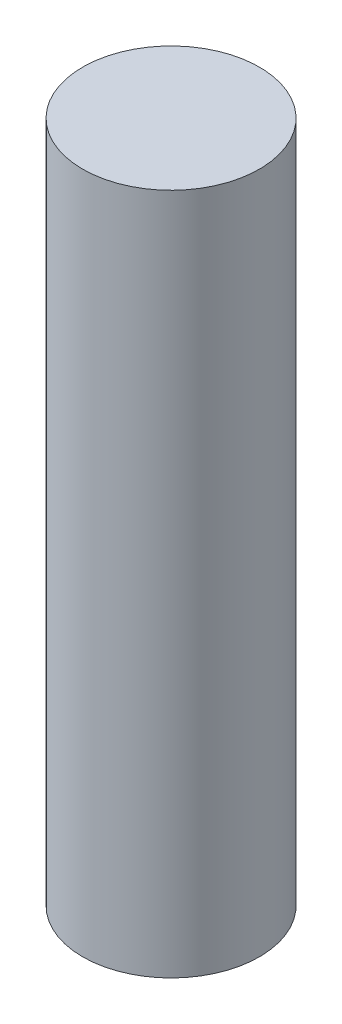
ISO-10303-21;
HEADER;
FILE_DESCRIPTION(('STEP AP214'),'2;1');
FILE_NAME('part.step','',(''),(''),'','','');
FILE_SCHEMA(('AUTOMOTIVE_DESIGN { 1 0 10303 214 1 1 1 1 }'));
ENDSEC;
DATA;
#1=APPLICATION_CONTEXT('core data for automotive mechanical design processes');
#2=APPLICATION_PROTOCOL_DEFINITION('international standard','automotive_design',2000,#1);
#3=PRODUCT_CONTEXT('',#1,'mechanical');
#4=PRODUCT('Part','Part','',(#3));
#5=PRODUCT_RELATED_PRODUCT_CATEGORY('part','',(#4));
#6=PRODUCT_DEFINITION_FORMATION('','',#4);
#7=PRODUCT_DEFINITION_CONTEXT('part definition',#1,'design');
#8=PRODUCT_DEFINITION('design','',#6,#7);
#9=PRODUCT_DEFINITION_SHAPE('','',#8);
#10=(LENGTH_UNIT() NAMED_UNIT(*) SI_UNIT(.MILLI.,.METRE.));
#11=(NAMED_UNIT(*) PLANE_ANGLE_UNIT() SI_UNIT($,.RADIAN.));
#12=(NAMED_UNIT(*) SI_UNIT($,.STERADIAN.) SOLID_ANGLE_UNIT());
#13=UNCERTAINTY_MEASURE_WITH_UNIT(LENGTH_MEASURE(1.E-05),#10,'distance_accuracy_value','');
#14=(GEOMETRIC_REPRESENTATION_CONTEXT(3) GLOBAL_UNCERTAINTY_ASSIGNED_CONTEXT((#13)) GLOBAL_UNIT_ASSIGNED_CONTEXT((#10,
#11,#12)) REPRESENTATION_CONTEXT('',''));
#15=CARTESIAN_POINT('',(0.,0.,0.));
#16=DIRECTION('',(0.,0.,1.));
#17=DIRECTION('',(1.,0.,0.));
#18=AXIS2_PLACEMENT_3D('',#15,#16,#17);
#19=CARTESIAN_POINT('',(0.,24.5,0.));
#20=DIRECTION('',(0.,-1.,0.));
#21=DIRECTION('',(0.,0.,-1.));
#22=AXIS2_PLACEMENT_3D('',#19,#20,#21);
#23=CYLINDRICAL_SURFACE('',#22,3.175);
#24=CARTESIAN_POINT('',(0.,24.5,0.));
#25=DIRECTION('',(0.,1.,0.));
#26=DIRECTION('',(0.,0.,1.));
#27=AXIS2_PLACEMENT_3D('',#24,#25,#26);
#28=CIRCLE('',#27,3.175);
#29=CARTESIAN_POINT('',(0.,24.5,3.175));
#30=VERTEX_POINT('',#29);
#31=EDGE_CURVE('E10',#30,#30,#28,.T.);
#32=ORIENTED_EDGE('',*,*,#31,.F.);
#33=EDGE_LOOP('',(#32));
#34=FACE_BOUND('',#33,.T.);
#35=CARTESIAN_POINT('',(0.,0.,0.));
#36=DIRECTION('',(0.,1.,0.));
#37=DIRECTION('',(0.,0.,1.));
#38=AXIS2_PLACEMENT_3D('',#35,#36,#37);
#39=CIRCLE('',#38,3.175);
#40=CARTESIAN_POINT('',(0.,0.,3.175));
#41=VERTEX_POINT('',#40);
#42=EDGE_CURVE('E34',#41,#41,#39,.T.);
#43=ORIENTED_EDGE('',*,*,#42,.T.);
#44=EDGE_LOOP('',(#43));
#45=FACE_BOUND('',#44,.T.);
#46=ADVANCED_FACE('F31',(#34,#45),#23,.T.);
#47=CARTESIAN_POINT('',(0.,24.5,0.));
#48=DIRECTION('',(0.,1.,0.));
#49=DIRECTION('',(0.,0.,1.));
#50=AXIS2_PLACEMENT_3D('',#47,#48,#49);
#51=PLANE('',#50);
#52=ORIENTED_EDGE('',*,*,#31,.T.);
#53=EDGE_LOOP('',(#52));
#54=FACE_BOUND('',#53,.T.);
#55=ADVANCED_FACE('F46',(#54),#51,.T.);
#56=CARTESIAN_POINT('',(0.,0.,0.));
#57=DIRECTION('',(0.,1.,0.));
#58=DIRECTION('',(0.,0.,1.));
#59=AXIS2_PLACEMENT_3D('',#56,#57,#58);
#60=PLANE('',#59);
#61=ORIENTED_EDGE('',*,*,#42,.F.);
#62=EDGE_LOOP('',(#61));
#63=FACE_BOUND('',#62,.T.);
#64=ADVANCED_FACE('F44',(#63),#60,.F.);
#65=CLOSED_SHELL('',(#46,#55,#64));
#66=MANIFOLD_SOLID_BREP('B2',#65);
#67=ADVANCED_BREP_SHAPE_REPRESENTATION('',(#18,#66),#14);
#68=SHAPE_DEFINITION_REPRESENTATION(#9,#67);
ENDSEC;
END-ISO-10303-21;
